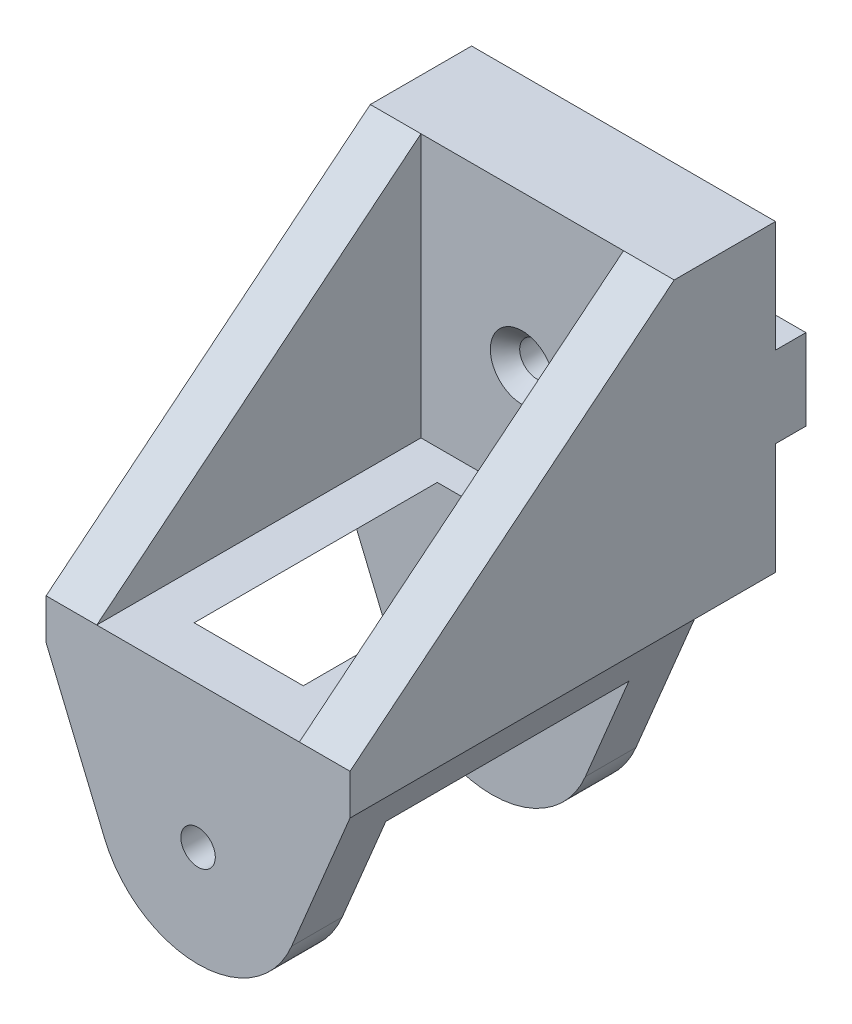
ISO-10303-21;
HEADER;
FILE_DESCRIPTION(('STEP AP214'),'2;1');
FILE_NAME('part.step','',(''),(''),'','','');
FILE_SCHEMA(('AUTOMOTIVE_DESIGN { 1 0 10303 214 1 1 1 1 }'));
ENDSEC;
DATA;
#1=APPLICATION_CONTEXT('core data for automotive mechanical design processes');
#2=APPLICATION_PROTOCOL_DEFINITION('international standard','automotive_design',2000,#1);
#3=PRODUCT_CONTEXT('',#1,'mechanical');
#4=PRODUCT('Part','Part','',(#3));
#5=PRODUCT_RELATED_PRODUCT_CATEGORY('part','',(#4));
#6=PRODUCT_DEFINITION_FORMATION('','',#4);
#7=PRODUCT_DEFINITION_CONTEXT('part definition',#1,'design');
#8=PRODUCT_DEFINITION('design','',#6,#7);
#9=PRODUCT_DEFINITION_SHAPE('','',#8);
#10=(LENGTH_UNIT() NAMED_UNIT(*) SI_UNIT(.MILLI.,.METRE.));
#11=(NAMED_UNIT(*) PLANE_ANGLE_UNIT() SI_UNIT($,.RADIAN.));
#12=(NAMED_UNIT(*) SI_UNIT($,.STERADIAN.) SOLID_ANGLE_UNIT());
#13=UNCERTAINTY_MEASURE_WITH_UNIT(LENGTH_MEASURE(1.E-05),#10,'distance_accuracy_value','');
#14=(GEOMETRIC_REPRESENTATION_CONTEXT(3) GLOBAL_UNCERTAINTY_ASSIGNED_CONTEXT((#13)) GLOBAL_UNIT_ASSIGNED_CONTEXT((#10,
#11,#12)) REPRESENTATION_CONTEXT('',''));
#15=CARTESIAN_POINT('',(0.,0.,0.));
#16=DIRECTION('',(0.,0.,1.));
#17=DIRECTION('',(1.,0.,0.));
#18=AXIS2_PLACEMENT_3D('',#15,#16,#17);
#19=CARTESIAN_POINT('',(15.,-10.,37.));
#20=DIRECTION('',(0.,0.,-1.));
#21=DIRECTION('',(-1.,0.,0.));
#22=AXIS2_PLACEMENT_3D('',#19,#20,#21);
#23=CYLINDRICAL_SURFACE('',#22,15.);
#24=CARTESIAN_POINT('',(15.,-10.,13.));
#25=DIRECTION('',(0.,0.,-1.));
#26=DIRECTION('',(-1.,0.,0.));
#27=AXIS2_PLACEMENT_3D('',#24,#25,#26);
#28=CIRCLE('',#27,15.);
#29=CARTESIAN_POINT('',(1.46910004326963,-3.52584010384713,13.));
#30=VERTEX_POINT('',#29);
#31=CARTESIAN_POINT('',(9.61483519286552,4.,13.));
#32=VERTEX_POINT('',#31);
#33=EDGE_CURVE('E315',#30,#32,#28,.T.);
#34=ORIENTED_EDGE('',*,*,#33,.T.);
#35=DIRECTION('',(0.,0.,-1.));
#36=VECTOR('',#35,1.);
#37=CARTESIAN_POINT('',(9.61483519286552,4.,37.));
#38=LINE('',#37,#36);
#39=CARTESIAN_POINT('',(9.61483519286552,4.,37.));
#40=VERTEX_POINT('',#39);
#41=EDGE_CURVE('E57',#32,#40,#38,.F.);
#42=ORIENTED_EDGE('',*,*,#41,.T.);
#43=CARTESIAN_POINT('',(15.,-10.,37.));
#44=DIRECTION('',(0.,0.,-1.));
#45=DIRECTION('',(-1.,0.,0.));
#46=AXIS2_PLACEMENT_3D('',#43,#44,#45);
#47=CIRCLE('',#46,15.);
#48=CARTESIAN_POINT('',(1.46910004326963,-3.52584010384713,37.));
#49=VERTEX_POINT('',#48);
#50=EDGE_CURVE('E307',#49,#40,#47,.T.);
#51=ORIENTED_EDGE('',*,*,#50,.F.);
#52=DIRECTION('',(0.,0.,-1.));
#53=VECTOR('',#52,1.);
#54=CARTESIAN_POINT('',(1.46910004326964,-3.52584010384713,37.));
#55=LINE('',#54,#53);
#56=EDGE_CURVE('E319',#30,#49,#55,.F.);
#57=ORIENTED_EDGE('',*,*,#56,.F.);
#58=EDGE_LOOP('',(#34,#42,#51,#57));
#59=FACE_BOUND('',#58,.T.);
#60=ADVANCED_FACE('F41',(#59),#23,.F.);
#61=CARTESIAN_POINT('',(15.,-10.,42.));
#62=DIRECTION('',(0.,0.,1.));
#63=DIRECTION('',(1.,0.,0.));
#64=AXIS2_PLACEMENT_3D('',#61,#62,#63);
#65=PLANE('',#64);
#66=DIRECTION('',(1.,0.,0.));
#67=VECTOR('',#66,1.);
#68=CARTESIAN_POINT('',(0.,4.,42.));
#69=LINE('',#68,#67);
#70=CARTESIAN_POINT('',(0.,4.,42.));
#71=VERTEX_POINT('',#70);
#72=CARTESIAN_POINT('',(5.,4.,42.));
#73=VERTEX_POINT('',#72);
#74=EDGE_CURVE('E211',#71,#73,#69,.T.);
#75=ORIENTED_EDGE('',*,*,#74,.F.);
#76=DIRECTION('',(0.,-1.,0.));
#77=VECTOR('',#76,1.);
#78=CARTESIAN_POINT('',(0.,0.,42.));
#79=LINE('',#78,#77);
#80=CARTESIAN_POINT('',(0.,0.,42.));
#81=VERTEX_POINT('',#80);
#82=EDGE_CURVE('E224',#71,#81,#79,.T.);
#83=ORIENTED_EDGE('',*,*,#82,.T.);
#84=DIRECTION('',(0.384615384615384,-0.923076923076923,0.));
#85=VECTOR('',#84,1.);
#86=CARTESIAN_POINT('',(0.,0.,42.));
#87=LINE('',#86,#85);
#88=CARTESIAN_POINT('',(5.76923076923077,-13.8461538461538,42.));
#89=VERTEX_POINT('',#88);
#90=EDGE_CURVE('E236',#81,#89,#87,.T.);
#91=ORIENTED_EDGE('',*,*,#90,.T.);
#92=CARTESIAN_POINT('',(15.,-10.,42.));
#93=DIRECTION('',(0.,0.,1.));
#94=DIRECTION('',(1.,0.,0.));
#95=AXIS2_PLACEMENT_3D('',#92,#93,#94);
#96=CIRCLE('',#95,10.);
#97=CARTESIAN_POINT('',(24.2307692307692,-13.8461538461539,42.));
#98=VERTEX_POINT('',#97);
#99=EDGE_CURVE('E239',#89,#98,#96,.T.);
#100=ORIENTED_EDGE('',*,*,#99,.T.);
#101=DIRECTION('',(0.384615384615384,0.923076923076923,0.));
#102=VECTOR('',#101,1.);
#103=CARTESIAN_POINT('',(30.,0.,42.));
#104=LINE('',#103,#102);
#105=CARTESIAN_POINT('',(30.,0.,42.));
#106=VERTEX_POINT('',#105);
#107=EDGE_CURVE('E247',#98,#106,#104,.T.);
#108=ORIENTED_EDGE('',*,*,#107,.T.);
#109=DIRECTION('',(0.,1.,0.));
#110=VECTOR('',#109,1.);
#111=CARTESIAN_POINT('',(30.,0.,42.));
#112=LINE('',#111,#110);
#113=CARTESIAN_POINT('',(30.,4.,42.));
#114=VERTEX_POINT('',#113);
#115=EDGE_CURVE('E237',#106,#114,#112,.T.);
#116=ORIENTED_EDGE('',*,*,#115,.T.);
#117=CARTESIAN_POINT('',(25.,4.,42.));
#118=VERTEX_POINT('',#117);
#119=EDGE_CURVE('E217',#118,#114,#69,.T.);
#120=ORIENTED_EDGE('',*,*,#119,.F.);
#121=DIRECTION('',(1.,0.,0.));
#122=VECTOR('',#121,1.);
#123=CARTESIAN_POINT('',(5.,4.,42.));
#124=LINE('',#123,#122);
#125=EDGE_CURVE('E228',#73,#118,#124,.T.);
#126=ORIENTED_EDGE('',*,*,#125,.F.);
#127=EDGE_LOOP('',(#75,#83,#91,#100,#108,#116,#120,#126));
#128=FACE_BOUND('',#127,.T.);
#129=CARTESIAN_POINT('',(15.,-10.,42.));
#130=DIRECTION('',(0.,0.,-1.));
#131=DIRECTION('',(-1.,0.,0.));
#132=AXIS2_PLACEMENT_3D('',#129,#130,#131);
#133=CIRCLE('',#132,1.7);
#134=CARTESIAN_POINT('',(13.3,-10.,42.));
#135=VERTEX_POINT('',#134);
#136=EDGE_CURVE('E374',#135,#135,#133,.T.);
#137=ORIENTED_EDGE('',*,*,#136,.T.);
#138=EDGE_LOOP('',(#137));
#139=FACE_BOUND('',#138,.T.);
#140=ADVANCED_FACE('F222',(#128,#139),#65,.T.);
#141=CARTESIAN_POINT('',(15.,-10.,0.));
#142=DIRECTION('',(0.,0.,1.));
#143=DIRECTION('',(1.,0.,0.));
#144=AXIS2_PLACEMENT_3D('',#141,#142,#143);
#145=PLANE('',#144);
#146=CARTESIAN_POINT('',(15.,15.,0.));
#147=DIRECTION('',(0.,0.,1.));
#148=DIRECTION('',(1.,0.,0.));
#149=AXIS2_PLACEMENT_3D('',#146,#147,#148);
#150=CIRCLE('',#149,1.7);
#151=CARTESIAN_POINT('',(16.7,15.,0.));
#152=VERTEX_POINT('',#151);
#153=EDGE_CURVE('E45',#152,#152,#150,.T.);
#154=ORIENTED_EDGE('',*,*,#153,.T.);
#155=EDGE_LOOP('',(#154));
#156=FACE_BOUND('',#155,.T.);
#157=DIRECTION('',(1.,0.,0.));
#158=VECTOR('',#157,1.);
#159=CARTESIAN_POINT('',(0.,19.,0.));
#160=LINE('',#159,#158);
#161=CARTESIAN_POINT('',(0.,19.,0.));
#162=VERTEX_POINT('',#161);
#163=CARTESIAN_POINT('',(5.,19.,0.));
#164=VERTEX_POINT('',#163);
#165=EDGE_CURVE('E386',#162,#164,#160,.T.);
#166=ORIENTED_EDGE('',*,*,#165,.F.);
#167=DIRECTION('',(0.,-1.,0.));
#168=VECTOR('',#167,1.);
#169=CARTESIAN_POINT('',(0.,0.,0.));
#170=LINE('',#169,#168);
#171=CARTESIAN_POINT('',(0.,30.,0.));
#172=VERTEX_POINT('',#171);
#173=EDGE_CURVE('E242',#172,#162,#170,.T.);
#174=ORIENTED_EDGE('',*,*,#173,.F.);
#175=DIRECTION('',(-1.,0.,0.));
#176=VECTOR('',#175,1.);
#177=CARTESIAN_POINT('',(0.,30.,0.));
#178=LINE('',#177,#176);
#179=CARTESIAN_POINT('',(30.,30.,0.));
#180=VERTEX_POINT('',#179);
#181=EDGE_CURVE('E253',#180,#172,#178,.T.);
#182=ORIENTED_EDGE('',*,*,#181,.F.);
#183=DIRECTION('',(0.,1.,0.));
#184=VECTOR('',#183,1.);
#185=CARTESIAN_POINT('',(30.,0.,0.));
#186=LINE('',#185,#184);
#187=CARTESIAN_POINT('',(30.,19.,0.));
#188=VERTEX_POINT('',#187);
#189=EDGE_CURVE('E254',#188,#180,#186,.T.);
#190=ORIENTED_EDGE('',*,*,#189,.F.);
#191=DIRECTION('',(1.,0.,0.));
#192=VECTOR('',#191,1.);
#193=CARTESIAN_POINT('',(30.,19.,0.));
#194=LINE('',#193,#192);
#195=CARTESIAN_POINT('',(25.,19.,0.));
#196=VERTEX_POINT('',#195);
#197=EDGE_CURVE('E415',#196,#188,#194,.T.);
#198=ORIENTED_EDGE('',*,*,#197,.F.);
#199=DIRECTION('',(0.,1.,0.));
#200=VECTOR('',#199,1.);
#201=CARTESIAN_POINT('',(25.,19.,0.));
#202=LINE('',#201,#200);
#203=CARTESIAN_POINT('',(25.,11.,0.));
#204=VERTEX_POINT('',#203);
#205=EDGE_CURVE('E423',#204,#196,#202,.T.);
#206=ORIENTED_EDGE('',*,*,#205,.F.);
#207=DIRECTION('',(-1.,0.,0.));
#208=VECTOR('',#207,1.);
#209=CARTESIAN_POINT('',(30.,11.,0.));
#210=LINE('',#209,#208);
#211=CARTESIAN_POINT('',(30.,11.,0.));
#212=VERTEX_POINT('',#211);
#213=EDGE_CURVE('E410',#212,#204,#210,.T.);
#214=ORIENTED_EDGE('',*,*,#213,.F.);
#215=CARTESIAN_POINT('',(30.,0.,0.));
#216=VERTEX_POINT('',#215);
#217=EDGE_CURVE('E250',#216,#212,#186,.T.);
#218=ORIENTED_EDGE('',*,*,#217,.F.);
#219=DIRECTION('',(1.,0.,0.));
#220=VECTOR('',#219,1.);
#221=CARTESIAN_POINT('',(30.,0.,0.));
#222=LINE('',#221,#220);
#223=CARTESIAN_POINT('',(0.,0.,0.));
#224=VERTEX_POINT('',#223);
#225=EDGE_CURVE('E437',#224,#216,#222,.T.);
#226=ORIENTED_EDGE('',*,*,#225,.F.);
#227=CARTESIAN_POINT('',(0.,11.,0.));
#228=VERTEX_POINT('',#227);
#229=EDGE_CURVE('E257',#228,#224,#170,.T.);
#230=ORIENTED_EDGE('',*,*,#229,.F.);
#231=DIRECTION('',(-1.,0.,0.));
#232=VECTOR('',#231,1.);
#233=CARTESIAN_POINT('',(0.,11.,0.));
#234=LINE('',#233,#232);
#235=CARTESIAN_POINT('',(5.,11.,0.));
#236=VERTEX_POINT('',#235);
#237=EDGE_CURVE('E391',#236,#228,#234,.T.);
#238=ORIENTED_EDGE('',*,*,#237,.F.);
#239=DIRECTION('',(0.,-1.,0.));
#240=VECTOR('',#239,1.);
#241=CARTESIAN_POINT('',(5.,19.,0.));
#242=LINE('',#241,#240);
#243=EDGE_CURVE('E398',#164,#236,#242,.T.);
#244=ORIENTED_EDGE('',*,*,#243,.F.);
#245=EDGE_LOOP('',(#166,#174,#182,#190,#198,#206,#214,#218,#226,#230,#238,#244));
#246=FACE_BOUND('',#245,.T.);
#247=ADVANCED_FACE('F335',(#156,#246),#145,.F.);
#248=CARTESIAN_POINT('',(0.,0.,42.));
#249=DIRECTION('',(0.923076923076923,0.384615384615384,0.));
#250=DIRECTION('',(-0.384615384615384,0.923076923076923,0.));
#251=AXIS2_PLACEMENT_3D('',#248,#249,#250);
#252=PLANE('',#251);
#253=DIRECTION('',(-0.384615384615384,0.923076923076923,0.));
#254=VECTOR('',#253,1.);
#255=CARTESIAN_POINT('',(0.,0.,8.));
#256=LINE('',#255,#254);
#257=CARTESIAN_POINT('',(5.76923076923077,-13.8461538461538,8.));
#258=VERTEX_POINT('',#257);
#259=CARTESIAN_POINT('',(0.,0.,8.));
#260=VERTEX_POINT('',#259);
#261=EDGE_CURVE('E287',#258,#260,#256,.T.);
#262=ORIENTED_EDGE('',*,*,#261,.F.);
#263=DIRECTION('',(0.,0.,-1.));
#264=VECTOR('',#263,1.);
#265=CARTESIAN_POINT('',(5.76923076923077,-13.8461538461538,42.));
#266=LINE('',#265,#264);
#267=CARTESIAN_POINT('',(5.76923076923077,-13.8461538461538,13.));
#268=VERTEX_POINT('',#267);
#269=EDGE_CURVE('E266',#268,#258,#266,.T.);
#270=ORIENTED_EDGE('',*,*,#269,.F.);
#271=DIRECTION('',(-0.384615384615384,0.923076923076923,0.));
#272=VECTOR('',#271,1.);
#273=CARTESIAN_POINT('',(0.,0.,13.));
#274=LINE('',#273,#272);
#275=EDGE_CURVE('E306',#268,#30,#274,.T.);
#276=ORIENTED_EDGE('',*,*,#275,.T.);
#277=ORIENTED_EDGE('',*,*,#56,.T.);
#278=DIRECTION('',(-0.384615384615384,0.923076923076923,0.));
#279=VECTOR('',#278,1.);
#280=CARTESIAN_POINT('',(0.,0.,37.));
#281=LINE('',#280,#279);
#282=CARTESIAN_POINT('',(5.76923076923077,-13.8461538461538,37.));
#283=VERTEX_POINT('',#282);
#284=EDGE_CURVE('E318',#283,#49,#281,.T.);
#285=ORIENTED_EDGE('',*,*,#284,.F.);
#286=EDGE_CURVE('E267',#89,#283,#266,.T.);
#287=ORIENTED_EDGE('',*,*,#286,.F.);
#288=ORIENTED_EDGE('',*,*,#90,.F.);
#289=DIRECTION('',(0.,0.,-1.));
#290=VECTOR('',#289,1.);
#291=CARTESIAN_POINT('',(0.,0.,42.));
#292=LINE('',#291,#290);
#293=EDGE_CURVE('E234',#81,#260,#292,.T.);
#294=ORIENTED_EDGE('',*,*,#293,.T.);
#295=EDGE_LOOP('',(#262,#270,#276,#277,#285,#287,#288,#294));
#296=FACE_BOUND('',#295,.T.);
#297=ADVANCED_FACE('F297',(#296),#252,.F.);
#298=CARTESIAN_POINT('',(30.,0.,42.));
#299=DIRECTION('',(-0.923076923076923,0.384615384615384,0.));
#300=DIRECTION('',(-0.384615384615384,-0.923076923076923,0.));
#301=AXIS2_PLACEMENT_3D('',#298,#299,#300);
#302=PLANE('',#301);
#303=DIRECTION('',(-0.384615384615384,-0.923076923076923,0.));
#304=VECTOR('',#303,1.);
#305=CARTESIAN_POINT('',(30.,0.,8.));
#306=LINE('',#305,#304);
#307=CARTESIAN_POINT('',(30.,0.,8.));
#308=VERTEX_POINT('',#307);
#309=CARTESIAN_POINT('',(24.2307692307692,-13.8461538461539,8.));
#310=VERTEX_POINT('',#309);
#311=EDGE_CURVE('E290',#308,#310,#306,.T.);
#312=ORIENTED_EDGE('',*,*,#311,.F.);
#313=DIRECTION('',(0.,0.,-1.));
#314=VECTOR('',#313,1.);
#315=CARTESIAN_POINT('',(30.,0.,42.));
#316=LINE('',#315,#314);
#317=EDGE_CURVE('E249',#106,#308,#316,.T.);
#318=ORIENTED_EDGE('',*,*,#317,.F.);
#319=ORIENTED_EDGE('',*,*,#107,.F.);
#320=DIRECTION('',(0.,0.,-1.));
#321=VECTOR('',#320,1.);
#322=CARTESIAN_POINT('',(24.2307692307692,-13.8461538461539,42.));
#323=LINE('',#322,#321);
#324=CARTESIAN_POINT('',(24.2307692307692,-13.8461538461539,37.));
#325=VERTEX_POINT('',#324);
#326=EDGE_CURVE('E263',#98,#325,#323,.T.);
#327=ORIENTED_EDGE('',*,*,#326,.T.);
#328=DIRECTION('',(-0.384615384615384,-0.923076923076923,0.));
#329=VECTOR('',#328,1.);
#330=CARTESIAN_POINT('',(30.,0.,37.));
#331=LINE('',#330,#329);
#332=CARTESIAN_POINT('',(28.5308999567304,-3.52584010384713,37.));
#333=VERTEX_POINT('',#332);
#334=EDGE_CURVE('E281',#333,#325,#331,.T.);
#335=ORIENTED_EDGE('',*,*,#334,.F.);
#336=DIRECTION('',(0.,0.,-1.));
#337=VECTOR('',#336,1.);
#338=CARTESIAN_POINT('',(28.5308999567304,-3.52584010384713,37.));
#339=LINE('',#338,#337);
#340=CARTESIAN_POINT('',(28.5308999567304,-3.52584010384713,13.));
#341=VERTEX_POINT('',#340);
#342=EDGE_CURVE('E278',#333,#341,#339,.T.);
#343=ORIENTED_EDGE('',*,*,#342,.T.);
#344=DIRECTION('',(-0.384615384615384,-0.923076923076923,0.));
#345=VECTOR('',#344,1.);
#346=CARTESIAN_POINT('',(30.,0.,13.));
#347=LINE('',#346,#345);
#348=CARTESIAN_POINT('',(24.2307692307692,-13.8461538461539,13.));
#349=VERTEX_POINT('',#348);
#350=EDGE_CURVE('E275',#341,#349,#347,.T.);
#351=ORIENTED_EDGE('',*,*,#350,.T.);
#352=EDGE_CURVE('E262',#349,#310,#323,.T.);
#353=ORIENTED_EDGE('',*,*,#352,.T.);
#354=EDGE_LOOP('',(#312,#318,#319,#327,#335,#343,#351,#353));
#355=FACE_BOUND('',#354,.T.);
#356=ADVANCED_FACE('F503',(#355),#302,.F.);
#357=CARTESIAN_POINT('',(15.,-10.,42.));
#358=DIRECTION('',(0.,0.,-1.));
#359=DIRECTION('',(-1.,0.,0.));
#360=AXIS2_PLACEMENT_3D('',#357,#358,#359);
#361=CYLINDRICAL_SURFACE('',#360,10.);
#362=CARTESIAN_POINT('',(15.,-10.,8.));
#363=DIRECTION('',(0.,0.,-1.));
#364=DIRECTION('',(-1.,0.,0.));
#365=AXIS2_PLACEMENT_3D('',#362,#363,#364);
#366=CIRCLE('',#365,10.);
#367=EDGE_CURVE('E50',#310,#258,#366,.T.);
#368=ORIENTED_EDGE('',*,*,#367,.F.);
#369=ORIENTED_EDGE('',*,*,#352,.F.);
#370=CARTESIAN_POINT('',(15.,-10.,13.));
#371=DIRECTION('',(0.,0.,-1.));
#372=DIRECTION('',(-1.,0.,0.));
#373=AXIS2_PLACEMENT_3D('',#370,#371,#372);
#374=CIRCLE('',#373,10.);
#375=EDGE_CURVE('E303',#349,#268,#374,.T.);
#376=ORIENTED_EDGE('',*,*,#375,.T.);
#377=ORIENTED_EDGE('',*,*,#269,.T.);
#378=EDGE_LOOP('',(#368,#369,#376,#377));
#379=FACE_BOUND('',#378,.T.);
#380=ADVANCED_FACE('F302',(#379),#361,.T.);
#381=CARTESIAN_POINT('',(15.,-10.,37.));
#382=DIRECTION('',(0.,0.,-1.));
#383=DIRECTION('',(-1.,0.,0.));
#384=AXIS2_PLACEMENT_3D('',#381,#382,#383);
#385=CIRCLE('',#384,10.);
#386=EDGE_CURVE('E309',#325,#283,#385,.T.);
#387=ORIENTED_EDGE('',*,*,#386,.F.);
#388=ORIENTED_EDGE('',*,*,#326,.F.);
#389=ORIENTED_EDGE('',*,*,#99,.F.);
#390=ORIENTED_EDGE('',*,*,#286,.T.);
#391=EDGE_LOOP('',(#387,#388,#389,#390));
#392=FACE_BOUND('',#391,.T.);
#393=ADVANCED_FACE('F509',(#392),#361,.T.);
#394=CARTESIAN_POINT('',(30.,0.,42.));
#395=DIRECTION('',(-1.,0.,0.));
#396=DIRECTION('',(0.,0.,1.));
#397=AXIS2_PLACEMENT_3D('',#394,#395,#396);
#398=PLANE('',#397);
#399=DIRECTION('',(0.,0.,-1.));
#400=VECTOR('',#399,1.);
#401=CARTESIAN_POINT('',(30.,30.,42.));
#402=LINE('',#401,#400);
#403=CARTESIAN_POINT('',(30.,30.,10.));
#404=VERTEX_POINT('',#403);
#405=EDGE_CURVE('E273',#404,#180,#402,.T.);
#406=ORIENTED_EDGE('',*,*,#405,.F.);
#407=DIRECTION('',(0.,0.630592625094466,-0.776114000116266));
#408=VECTOR('',#407,1.);
#409=CARTESIAN_POINT('',(30.,30.,10.));
#410=LINE('',#409,#408);
#411=EDGE_CURVE('E218',#114,#404,#410,.T.);
#412=ORIENTED_EDGE('',*,*,#411,.F.);
#413=ORIENTED_EDGE('',*,*,#115,.F.);
#414=ORIENTED_EDGE('',*,*,#317,.T.);
#415=DIRECTION('',(0.,0.,-1.));
#416=VECTOR('',#415,1.);
#417=CARTESIAN_POINT('',(30.,0.,49.0555127546399));
#418=LINE('',#417,#416);
#419=EDGE_CURVE('E440',#308,#216,#418,.T.);
#420=ORIENTED_EDGE('',*,*,#419,.T.);
#421=ORIENTED_EDGE('',*,*,#217,.T.);
#422=DIRECTION('',(0.,0.,1.));
#423=VECTOR('',#422,1.);
#424=CARTESIAN_POINT('',(30.,11.,-3.));
#425=LINE('',#424,#423);
#426=CARTESIAN_POINT('',(30.,11.,-3.));
#427=VERTEX_POINT('',#426);
#428=EDGE_CURVE('E434',#427,#212,#425,.T.);
#429=ORIENTED_EDGE('',*,*,#428,.F.);
#430=DIRECTION('',(0.,-1.,0.));
#431=VECTOR('',#430,1.);
#432=CARTESIAN_POINT('',(30.,19.,-3.));
#433=LINE('',#432,#431);
#434=CARTESIAN_POINT('',(30.,19.,-3.));
#435=VERTEX_POINT('',#434);
#436=EDGE_CURVE('E411',#435,#427,#433,.T.);
#437=ORIENTED_EDGE('',*,*,#436,.F.);
#438=DIRECTION('',(0.,0.,1.));
#439=VECTOR('',#438,1.);
#440=CARTESIAN_POINT('',(30.,19.,-3.));
#441=LINE('',#440,#439);
#442=EDGE_CURVE('E330',#435,#188,#441,.T.);
#443=ORIENTED_EDGE('',*,*,#442,.T.);
#444=ORIENTED_EDGE('',*,*,#189,.T.);
#445=EDGE_LOOP('',(#406,#412,#413,#414,#420,#421,#429,#437,#443,#444));
#446=FACE_BOUND('',#445,.T.);
#447=ADVANCED_FACE('F43',(#446),#398,.F.);
#448=CARTESIAN_POINT('',(0.,30.,42.));
#449=DIRECTION('',(0.,-1.,0.));
#450=DIRECTION('',(0.,0.,-1.));
#451=AXIS2_PLACEMENT_3D('',#448,#449,#450);
#452=PLANE('',#451);
#453=DIRECTION('',(0.,0.,-1.));
#454=VECTOR('',#453,1.);
#455=CARTESIAN_POINT('',(0.,30.,42.));
#456=LINE('',#455,#454);
#457=CARTESIAN_POINT('',(0.,30.,10.));
#458=VERTEX_POINT('',#457);
#459=EDGE_CURVE('E271',#458,#172,#456,.T.);
#460=ORIENTED_EDGE('',*,*,#459,.F.);
#461=DIRECTION('',(1.,0.,0.));
#462=VECTOR('',#461,1.);
#463=CARTESIAN_POINT('',(0.,30.,10.));
#464=LINE('',#463,#462);
#465=CARTESIAN_POINT('',(5.,30.,10.));
#466=VERTEX_POINT('',#465);
#467=EDGE_CURVE('E214',#458,#466,#464,.T.);
#468=ORIENTED_EDGE('',*,*,#467,.T.);
#469=DIRECTION('',(-1.,0.,0.));
#470=VECTOR('',#469,1.);
#471=CARTESIAN_POINT('',(5.,30.,10.));
#472=LINE('',#471,#470);
#473=CARTESIAN_POINT('',(25.,30.,10.));
#474=VERTEX_POINT('',#473);
#475=EDGE_CURVE('E341',#474,#466,#472,.T.);
#476=ORIENTED_EDGE('',*,*,#475,.F.);
#477=EDGE_CURVE('E229',#474,#404,#464,.T.);
#478=ORIENTED_EDGE('',*,*,#477,.T.);
#479=ORIENTED_EDGE('',*,*,#405,.T.);
#480=ORIENTED_EDGE('',*,*,#181,.T.);
#481=EDGE_LOOP('',(#460,#468,#476,#478,#479,#480));
#482=FACE_BOUND('',#481,.T.);
#483=ADVANCED_FACE('F337',(#482),#452,.F.);
#484=CARTESIAN_POINT('',(0.,0.,42.));
#485=DIRECTION('',(1.,0.,0.));
#486=DIRECTION('',(0.,0.,-1.));
#487=AXIS2_PLACEMENT_3D('',#484,#485,#486);
#488=PLANE('',#487);
#489=ORIENTED_EDGE('',*,*,#82,.F.);
#490=DIRECTION('',(0.,0.630592625094466,-0.776114000116266));
#491=VECTOR('',#490,1.);
#492=CARTESIAN_POINT('',(0.,30.,10.));
#493=LINE('',#492,#491);
#494=EDGE_CURVE('E208',#71,#458,#493,.T.);
#495=ORIENTED_EDGE('',*,*,#494,.T.);
#496=ORIENTED_EDGE('',*,*,#459,.T.);
#497=ORIENTED_EDGE('',*,*,#173,.T.);
#498=DIRECTION('',(0.,0.,1.));
#499=VECTOR('',#498,1.);
#500=CARTESIAN_POINT('',(0.,19.,-3.));
#501=LINE('',#500,#499);
#502=CARTESIAN_POINT('',(0.,19.,-3.));
#503=VERTEX_POINT('',#502);
#504=EDGE_CURVE('E408',#503,#162,#501,.T.);
#505=ORIENTED_EDGE('',*,*,#504,.F.);
#506=DIRECTION('',(0.,1.,0.));
#507=VECTOR('',#506,1.);
#508=CARTESIAN_POINT('',(0.,19.,-3.));
#509=LINE('',#508,#507);
#510=CARTESIAN_POINT('',(0.,11.,-3.));
#511=VERTEX_POINT('',#510);
#512=EDGE_CURVE('E387',#511,#503,#509,.T.);
#513=ORIENTED_EDGE('',*,*,#512,.F.);
#514=DIRECTION('',(0.,0.,1.));
#515=VECTOR('',#514,1.);
#516=CARTESIAN_POINT('',(0.,11.,-3.));
#517=LINE('',#516,#515);
#518=EDGE_CURVE('E64',#511,#228,#517,.T.);
#519=ORIENTED_EDGE('',*,*,#518,.T.);
#520=ORIENTED_EDGE('',*,*,#229,.T.);
#521=DIRECTION('',(0.,0.,-1.));
#522=VECTOR('',#521,1.);
#523=CARTESIAN_POINT('',(0.,0.,49.0555127546399));
#524=LINE('',#523,#522);
#525=EDGE_CURVE('E442',#260,#224,#524,.T.);
#526=ORIENTED_EDGE('',*,*,#525,.F.);
#527=ORIENTED_EDGE('',*,*,#293,.F.);
#528=EDGE_LOOP('',(#489,#495,#496,#497,#505,#513,#519,#520,#526,#527));
#529=FACE_BOUND('',#528,.T.);
#530=ADVANCED_FACE('F231',(#529),#488,.F.);
#531=CARTESIAN_POINT('',(20.3851648071345,4.,37.));
#532=VERTEX_POINT('',#531);
#533=EDGE_CURVE('E312',#532,#333,#47,.T.);
#534=ORIENTED_EDGE('',*,*,#533,.F.);
#535=DIRECTION('',(0.,0.,-1.));
#536=VECTOR('',#535,1.);
#537=CARTESIAN_POINT('',(20.3851648071345,4.,37.));
#538=LINE('',#537,#536);
#539=CARTESIAN_POINT('',(20.3851648071345,4.,13.));
#540=VERTEX_POINT('',#539);
#541=EDGE_CURVE('E366',#532,#540,#538,.T.);
#542=ORIENTED_EDGE('',*,*,#541,.T.);
#543=EDGE_CURVE('E299',#540,#341,#28,.T.);
#544=ORIENTED_EDGE('',*,*,#543,.T.);
#545=ORIENTED_EDGE('',*,*,#342,.F.);
#546=EDGE_LOOP('',(#534,#542,#544,#545));
#547=FACE_BOUND('',#546,.T.);
#548=ADVANCED_FACE('F478',(#547),#23,.F.);
#549=CARTESIAN_POINT('',(15.,-10.,37.));
#550=DIRECTION('',(0.,0.,-1.));
#551=DIRECTION('',(-1.,0.,0.));
#552=AXIS2_PLACEMENT_3D('',#549,#550,#551);
#553=PLANE('',#552);
#554=DIRECTION('',(-1.,0.,0.));
#555=VECTOR('',#554,1.);
#556=CARTESIAN_POINT('',(15.,4.,37.));
#557=LINE('',#556,#555);
#558=EDGE_CURVE('E372',#532,#40,#557,.T.);
#559=ORIENTED_EDGE('',*,*,#558,.F.);
#560=ORIENTED_EDGE('',*,*,#533,.T.);
#561=ORIENTED_EDGE('',*,*,#334,.T.);
#562=ORIENTED_EDGE('',*,*,#386,.T.);
#563=ORIENTED_EDGE('',*,*,#284,.T.);
#564=ORIENTED_EDGE('',*,*,#50,.T.);
#565=EDGE_LOOP('',(#559,#560,#561,#562,#563,#564));
#566=FACE_BOUND('',#565,.T.);
#567=CARTESIAN_POINT('',(15.,-10.,37.));
#568=DIRECTION('',(0.,0.,-1.));
#569=DIRECTION('',(-1.,0.,0.));
#570=AXIS2_PLACEMENT_3D('',#567,#568,#569);
#571=CIRCLE('',#570,1.7);
#572=CARTESIAN_POINT('',(13.3,-10.,37.));
#573=VERTEX_POINT('',#572);
#574=EDGE_CURVE('E383',#573,#573,#571,.T.);
#575=ORIENTED_EDGE('',*,*,#574,.F.);
#576=EDGE_LOOP('',(#575));
#577=FACE_BOUND('',#576,.T.);
#578=ADVANCED_FACE('F486',(#566,#577),#553,.T.);
#579=CARTESIAN_POINT('',(15.,-10.,13.));
#580=DIRECTION('',(0.,0.,-1.));
#581=DIRECTION('',(-1.,0.,0.));
#582=AXIS2_PLACEMENT_3D('',#579,#580,#581);
#583=PLANE('',#582);
#584=CARTESIAN_POINT('',(15.,-10.,13.));
#585=DIRECTION('',(0.,0.,-1.));
#586=DIRECTION('',(-1.,0.,0.));
#587=AXIS2_PLACEMENT_3D('',#584,#585,#586);
#588=CIRCLE('',#587,1.7);
#589=CARTESIAN_POINT('',(13.3,-10.,13.));
#590=VERTEX_POINT('',#589);
#591=EDGE_CURVE('E380',#590,#590,#588,.T.);
#592=ORIENTED_EDGE('',*,*,#591,.T.);
#593=EDGE_LOOP('',(#592));
#594=FACE_BOUND('',#593,.T.);
#595=ORIENTED_EDGE('',*,*,#543,.F.);
#596=DIRECTION('',(-1.,0.,0.));
#597=VECTOR('',#596,1.);
#598=CARTESIAN_POINT('',(15.,4.,13.));
#599=LINE('',#598,#597);
#600=EDGE_CURVE('E12',#540,#32,#599,.T.);
#601=ORIENTED_EDGE('',*,*,#600,.T.);
#602=ORIENTED_EDGE('',*,*,#33,.F.);
#603=ORIENTED_EDGE('',*,*,#275,.F.);
#604=ORIENTED_EDGE('',*,*,#375,.F.);
#605=ORIENTED_EDGE('',*,*,#350,.F.);
#606=EDGE_LOOP('',(#595,#601,#602,#603,#604,#605));
#607=FACE_BOUND('',#606,.T.);
#608=ADVANCED_FACE('F492',(#594,#607),#583,.F.);
#609=CARTESIAN_POINT('',(15.,-10.,8.));
#610=DIRECTION('',(0.,0.,-1.));
#611=DIRECTION('',(-1.,0.,0.));
#612=AXIS2_PLACEMENT_3D('',#609,#610,#611);
#613=PLANE('',#612);
#614=CARTESIAN_POINT('',(15.,-10.,8.));
#615=DIRECTION('',(0.,0.,-1.));
#616=DIRECTION('',(-1.,0.,0.));
#617=AXIS2_PLACEMENT_3D('',#614,#615,#616);
#618=CIRCLE('',#617,1.7);
#619=CARTESIAN_POINT('',(13.3,-10.,8.));
#620=VERTEX_POINT('',#619);
#621=EDGE_CURVE('E377',#620,#620,#618,.T.);
#622=ORIENTED_EDGE('',*,*,#621,.F.);
#623=EDGE_LOOP('',(#622));
#624=FACE_BOUND('',#623,.T.);
#625=ORIENTED_EDGE('',*,*,#261,.T.);
#626=DIRECTION('',(-1.,0.,0.));
#627=VECTOR('',#626,1.);
#628=CARTESIAN_POINT('',(30.,0.,8.));
#629=LINE('',#628,#627);
#630=EDGE_CURVE('E438',#308,#260,#629,.T.);
#631=ORIENTED_EDGE('',*,*,#630,.F.);
#632=ORIENTED_EDGE('',*,*,#311,.T.);
#633=ORIENTED_EDGE('',*,*,#367,.T.);
#634=EDGE_LOOP('',(#625,#631,#632,#633));
#635=FACE_BOUND('',#634,.T.);
#636=ADVANCED_FACE('F286',(#624,#635),#613,.T.);
#637=CARTESIAN_POINT('',(30.,0.,49.0555127546399));
#638=DIRECTION('',(0.,1.,0.));
#639=DIRECTION('',(0.,0.,1.));
#640=AXIS2_PLACEMENT_3D('',#637,#638,#639);
#641=PLANE('',#640);
#642=ORIENTED_EDGE('',*,*,#630,.T.);
#643=ORIENTED_EDGE('',*,*,#525,.T.);
#644=ORIENTED_EDGE('',*,*,#225,.T.);
#645=ORIENTED_EDGE('',*,*,#419,.F.);
#646=EDGE_LOOP('',(#642,#643,#644,#645));
#647=FACE_BOUND('',#646,.T.);
#648=ADVANCED_FACE('F449',(#647),#641,.F.);
#649=CARTESIAN_POINT('',(30.,11.,-3.));
#650=DIRECTION('',(0.,1.,0.));
#651=DIRECTION('',(0.,0.,1.));
#652=AXIS2_PLACEMENT_3D('',#649,#650,#651);
#653=PLANE('',#652);
#654=ORIENTED_EDGE('',*,*,#213,.T.);
#655=DIRECTION('',(0.,0.,1.));
#656=VECTOR('',#655,1.);
#657=CARTESIAN_POINT('',(25.,11.,-3.));
#658=LINE('',#657,#656);
#659=CARTESIAN_POINT('',(25.,11.,-3.));
#660=VERTEX_POINT('',#659);
#661=EDGE_CURVE('E431',#660,#204,#658,.T.);
#662=ORIENTED_EDGE('',*,*,#661,.F.);
#663=DIRECTION('',(-1.,0.,0.));
#664=VECTOR('',#663,1.);
#665=CARTESIAN_POINT('',(30.,11.,-3.));
#666=LINE('',#665,#664);
#667=EDGE_CURVE('E414',#427,#660,#666,.T.);
#668=ORIENTED_EDGE('',*,*,#667,.F.);
#669=ORIENTED_EDGE('',*,*,#428,.T.);
#670=EDGE_LOOP('',(#654,#662,#668,#669));
#671=FACE_BOUND('',#670,.T.);
#672=ADVANCED_FACE('F456',(#671),#653,.F.);
#673=CARTESIAN_POINT('',(25.,19.,-3.));
#674=DIRECTION('',(1.,0.,0.));
#675=DIRECTION('',(0.,1.,0.));
#676=AXIS2_PLACEMENT_3D('',#673,#674,#675);
#677=PLANE('',#676);
#678=ORIENTED_EDGE('',*,*,#205,.T.);
#679=DIRECTION('',(0.,0.,1.));
#680=VECTOR('',#679,1.);
#681=CARTESIAN_POINT('',(25.,19.,-3.));
#682=LINE('',#681,#680);
#683=CARTESIAN_POINT('',(25.,19.,-3.));
#684=VERTEX_POINT('',#683);
#685=EDGE_CURVE('E428',#684,#196,#682,.T.);
#686=ORIENTED_EDGE('',*,*,#685,.F.);
#687=DIRECTION('',(0.,1.,0.));
#688=VECTOR('',#687,1.);
#689=CARTESIAN_POINT('',(25.,19.,-3.));
#690=LINE('',#689,#688);
#691=EDGE_CURVE('E417',#660,#684,#690,.T.);
#692=ORIENTED_EDGE('',*,*,#691,.F.);
#693=ORIENTED_EDGE('',*,*,#661,.T.);
#694=EDGE_LOOP('',(#678,#686,#692,#693));
#695=FACE_BOUND('',#694,.T.);
#696=ADVANCED_FACE('F466',(#695),#677,.F.);
#697=CARTESIAN_POINT('',(30.,19.,-3.));
#698=DIRECTION('',(0.,-1.,0.));
#699=DIRECTION('',(1.,0.,0.));
#700=AXIS2_PLACEMENT_3D('',#697,#698,#699);
#701=PLANE('',#700);
#702=ORIENTED_EDGE('',*,*,#197,.T.);
#703=ORIENTED_EDGE('',*,*,#442,.F.);
#704=DIRECTION('',(1.,0.,0.));
#705=VECTOR('',#704,1.);
#706=CARTESIAN_POINT('',(30.,19.,-3.));
#707=LINE('',#706,#705);
#708=EDGE_CURVE('E419',#684,#435,#707,.T.);
#709=ORIENTED_EDGE('',*,*,#708,.F.);
#710=ORIENTED_EDGE('',*,*,#685,.T.);
#711=EDGE_LOOP('',(#702,#703,#709,#710));
#712=FACE_BOUND('',#711,.T.);
#713=ADVANCED_FACE('F464',(#712),#701,.F.);
#714=CARTESIAN_POINT('',(0.,0.,-3.));
#715=DIRECTION('',(0.,0.,-1.));
#716=DIRECTION('',(-1.,0.,0.));
#717=AXIS2_PLACEMENT_3D('',#714,#715,#716);
#718=PLANE('',#717);
#719=ORIENTED_EDGE('',*,*,#436,.T.);
#720=ORIENTED_EDGE('',*,*,#667,.T.);
#721=ORIENTED_EDGE('',*,*,#691,.T.);
#722=ORIENTED_EDGE('',*,*,#708,.T.);
#723=EDGE_LOOP('',(#719,#720,#721,#722));
#724=FACE_BOUND('',#723,.T.);
#725=ADVANCED_FACE('F460',(#724),#718,.T.);
#726=CARTESIAN_POINT('',(0.,19.,-3.));
#727=DIRECTION('',(0.,-1.,0.));
#728=DIRECTION('',(0.,0.,-1.));
#729=AXIS2_PLACEMENT_3D('',#726,#727,#728);
#730=PLANE('',#729);
#731=ORIENTED_EDGE('',*,*,#165,.T.);
#732=DIRECTION('',(0.,0.,1.));
#733=VECTOR('',#732,1.);
#734=CARTESIAN_POINT('',(5.,19.,-3.));
#735=LINE('',#734,#733);
#736=CARTESIAN_POINT('',(5.,19.,-3.));
#737=VERTEX_POINT('',#736);
#738=EDGE_CURVE('E405',#737,#164,#735,.T.);
#739=ORIENTED_EDGE('',*,*,#738,.F.);
#740=DIRECTION('',(1.,0.,0.));
#741=VECTOR('',#740,1.);
#742=CARTESIAN_POINT('',(0.,19.,-3.));
#743=LINE('',#742,#741);
#744=EDGE_CURVE('E390',#503,#737,#743,.T.);
#745=ORIENTED_EDGE('',*,*,#744,.F.);
#746=ORIENTED_EDGE('',*,*,#504,.T.);
#747=EDGE_LOOP('',(#731,#739,#745,#746));
#748=FACE_BOUND('',#747,.T.);
#749=ADVANCED_FACE('F578',(#748),#730,.F.);
#750=CARTESIAN_POINT('',(5.,19.,-3.));
#751=DIRECTION('',(-1.,0.,0.));
#752=DIRECTION('',(0.,-1.,0.));
#753=AXIS2_PLACEMENT_3D('',#750,#751,#752);
#754=PLANE('',#753);
#755=ORIENTED_EDGE('',*,*,#243,.T.);
#756=DIRECTION('',(0.,0.,1.));
#757=VECTOR('',#756,1.);
#758=CARTESIAN_POINT('',(5.,11.,-3.));
#759=LINE('',#758,#757);
#760=CARTESIAN_POINT('',(5.,11.,-3.));
#761=VERTEX_POINT('',#760);
#762=EDGE_CURVE('E402',#761,#236,#759,.T.);
#763=ORIENTED_EDGE('',*,*,#762,.F.);
#764=DIRECTION('',(0.,-1.,0.));
#765=VECTOR('',#764,1.);
#766=CARTESIAN_POINT('',(5.,19.,-3.));
#767=LINE('',#766,#765);
#768=EDGE_CURVE('E393',#737,#761,#767,.T.);
#769=ORIENTED_EDGE('',*,*,#768,.F.);
#770=ORIENTED_EDGE('',*,*,#738,.T.);
#771=EDGE_LOOP('',(#755,#763,#769,#770));
#772=FACE_BOUND('',#771,.T.);
#773=ADVANCED_FACE('F574',(#772),#754,.F.);
#774=CARTESIAN_POINT('',(0.,11.,-3.));
#775=DIRECTION('',(0.,1.,0.));
#776=DIRECTION('',(-1.,0.,0.));
#777=AXIS2_PLACEMENT_3D('',#774,#775,#776);
#778=PLANE('',#777);
#779=ORIENTED_EDGE('',*,*,#237,.T.);
#780=ORIENTED_EDGE('',*,*,#518,.F.);
#781=DIRECTION('',(-1.,0.,0.));
#782=VECTOR('',#781,1.);
#783=CARTESIAN_POINT('',(0.,11.,-3.));
#784=LINE('',#783,#782);
#785=EDGE_CURVE('E395',#761,#511,#784,.T.);
#786=ORIENTED_EDGE('',*,*,#785,.F.);
#787=ORIENTED_EDGE('',*,*,#762,.T.);
#788=EDGE_LOOP('',(#779,#780,#786,#787));
#789=FACE_BOUND('',#788,.T.);
#790=ADVANCED_FACE('F570',(#789),#778,.F.);
#791=CARTESIAN_POINT('',(0.,0.,-3.));
#792=DIRECTION('',(0.,0.,1.));
#793=DIRECTION('',(1.,0.,0.));
#794=AXIS2_PLACEMENT_3D('',#791,#792,#793);
#795=PLANE('',#794);
#796=ORIENTED_EDGE('',*,*,#512,.T.);
#797=ORIENTED_EDGE('',*,*,#744,.T.);
#798=ORIENTED_EDGE('',*,*,#768,.T.);
#799=ORIENTED_EDGE('',*,*,#785,.T.);
#800=EDGE_LOOP('',(#796,#797,#798,#799));
#801=FACE_BOUND('',#800,.T.);
#802=ADVANCED_FACE('F567',(#801),#795,.F.);
#803=CARTESIAN_POINT('',(15.,-10.,8.));
#804=DIRECTION('',(0.,0.,-1.));
#805=DIRECTION('',(-1.,0.,0.));
#806=AXIS2_PLACEMENT_3D('',#803,#804,#805);
#807=CYLINDRICAL_SURFACE('',#806,1.7);
#808=ORIENTED_EDGE('',*,*,#621,.T.);
#809=EDGE_LOOP('',(#808));
#810=FACE_BOUND('',#809,.T.);
#811=ORIENTED_EDGE('',*,*,#591,.F.);
#812=EDGE_LOOP('',(#811));
#813=FACE_BOUND('',#812,.T.);
#814=ADVANCED_FACE('F565',(#810,#813),#807,.F.);
#815=ORIENTED_EDGE('',*,*,#574,.T.);
#816=EDGE_LOOP('',(#815));
#817=FACE_BOUND('',#816,.T.);
#818=ORIENTED_EDGE('',*,*,#136,.F.);
#819=EDGE_LOOP('',(#818));
#820=FACE_BOUND('',#819,.T.);
#821=ADVANCED_FACE('F562',(#817,#820),#807,.F.);
#822=CARTESIAN_POINT('',(5.,4.,42.));
#823=DIRECTION('',(-1.,0.,0.));
#824=DIRECTION('',(0.,0.,1.));
#825=AXIS2_PLACEMENT_3D('',#822,#823,#824);
#826=PLANE('',#825);
#827=DIRECTION('',(0.,1.,0.));
#828=VECTOR('',#827,1.);
#829=CARTESIAN_POINT('',(5.,4.,10.));
#830=LINE('',#829,#828);
#831=CARTESIAN_POINT('',(5.,4.,10.));
#832=VERTEX_POINT('',#831);
#833=EDGE_CURVE('E363',#832,#466,#830,.T.);
#834=ORIENTED_EDGE('',*,*,#833,.T.);
#835=DIRECTION('',(0.,-0.630592625094466,0.776114000116266));
#836=VECTOR('',#835,1.);
#837=CARTESIAN_POINT('',(5.,4.,42.));
#838=LINE('',#837,#836);
#839=EDGE_CURVE('E349',#466,#73,#838,.T.);
#840=ORIENTED_EDGE('',*,*,#839,.T.);
#841=DIRECTION('',(0.,0.,1.));
#842=VECTOR('',#841,1.);
#843=CARTESIAN_POINT('',(5.,4.,42.));
#844=LINE('',#843,#842);
#845=EDGE_CURVE('E351',#832,#73,#844,.T.);
#846=ORIENTED_EDGE('',*,*,#845,.F.);
#847=EDGE_LOOP('',(#834,#840,#846));
#848=FACE_BOUND('',#847,.T.);
#849=ADVANCED_FACE('F522',(#848),#826,.F.);
#850=CARTESIAN_POINT('',(5.,4.,10.));
#851=DIRECTION('',(0.,0.,-1.));
#852=DIRECTION('',(-1.,0.,0.));
#853=AXIS2_PLACEMENT_3D('',#850,#851,#852);
#854=PLANE('',#853);
#855=CARTESIAN_POINT('',(15.,15.,10.));
#856=DIRECTION('',(0.,0.,1.));
#857=DIRECTION('',(1.,0.,0.));
#858=AXIS2_PLACEMENT_3D('',#855,#856,#857);
#859=CIRCLE('',#858,3.15);
#860=CARTESIAN_POINT('',(18.15,15.,10.));
#861=VERTEX_POINT('',#860);
#862=EDGE_CURVE('E530',#861,#861,#859,.T.);
#863=ORIENTED_EDGE('',*,*,#862,.F.);
#864=EDGE_LOOP('',(#863));
#865=FACE_BOUND('',#864,.T.);
#866=ORIENTED_EDGE('',*,*,#475,.T.);
#867=ORIENTED_EDGE('',*,*,#833,.F.);
#868=DIRECTION('',(-1.,0.,0.));
#869=VECTOR('',#868,1.);
#870=CARTESIAN_POINT('',(5.,4.,10.));
#871=LINE('',#870,#869);
#872=CARTESIAN_POINT('',(25.,4.,10.));
#873=VERTEX_POINT('',#872);
#874=EDGE_CURVE('E358',#873,#832,#871,.T.);
#875=ORIENTED_EDGE('',*,*,#874,.F.);
#876=DIRECTION('',(0.,1.,0.));
#877=VECTOR('',#876,1.);
#878=CARTESIAN_POINT('',(25.,4.,10.));
#879=LINE('',#878,#877);
#880=EDGE_CURVE('E361',#873,#474,#879,.T.);
#881=ORIENTED_EDGE('',*,*,#880,.T.);
#882=EDGE_LOOP('',(#866,#867,#875,#881));
#883=FACE_BOUND('',#882,.T.);
#884=ADVANCED_FACE('F524',(#865,#883),#854,.F.);
#885=CARTESIAN_POINT('',(25.,4.,42.));
#886=DIRECTION('',(1.,0.,0.));
#887=DIRECTION('',(0.,0.,-1.));
#888=AXIS2_PLACEMENT_3D('',#885,#886,#887);
#889=PLANE('',#888);
#890=DIRECTION('',(0.,0.,-1.));
#891=VECTOR('',#890,1.);
#892=CARTESIAN_POINT('',(25.,4.,42.));
#893=LINE('',#892,#891);
#894=EDGE_CURVE('E355',#118,#873,#893,.T.);
#895=ORIENTED_EDGE('',*,*,#894,.F.);
#896=DIRECTION('',(0.,0.630592625094466,-0.776114000116266));
#897=VECTOR('',#896,1.);
#898=CARTESIAN_POINT('',(25.,4.,42.));
#899=LINE('',#898,#897);
#900=EDGE_CURVE('E345',#118,#474,#899,.T.);
#901=ORIENTED_EDGE('',*,*,#900,.T.);
#902=ORIENTED_EDGE('',*,*,#880,.F.);
#903=EDGE_LOOP('',(#895,#901,#902));
#904=FACE_BOUND('',#903,.T.);
#905=ADVANCED_FACE('F517',(#904),#889,.F.);
#906=CARTESIAN_POINT('',(0.,4.,0.));
#907=DIRECTION('',(0.,-1.,0.));
#908=DIRECTION('',(0.,0.,-1.));
#909=AXIS2_PLACEMENT_3D('',#906,#907,#908);
#910=PLANE('',#909);
#911=ORIENTED_EDGE('',*,*,#558,.T.);
#912=ORIENTED_EDGE('',*,*,#41,.F.);
#913=ORIENTED_EDGE('',*,*,#600,.F.);
#914=ORIENTED_EDGE('',*,*,#541,.F.);
#915=EDGE_LOOP('',(#911,#912,#913,#914));
#916=FACE_BOUND('',#915,.T.);
#917=ORIENTED_EDGE('',*,*,#845,.T.);
#918=ORIENTED_EDGE('',*,*,#125,.T.);
#919=ORIENTED_EDGE('',*,*,#894,.T.);
#920=ORIENTED_EDGE('',*,*,#874,.T.);
#921=EDGE_LOOP('',(#917,#918,#919,#920));
#922=FACE_BOUND('',#921,.T.);
#923=ADVANCED_FACE('F513',(#916,#922),#910,.F.);
#924=CARTESIAN_POINT('',(0.,30.,10.));
#925=DIRECTION('',(0.,-0.776114000116266,-0.630592625094466));
#926=DIRECTION('',(0.,0.630592625094466,-0.776114000116266));
#927=AXIS2_PLACEMENT_3D('',#924,#925,#926);
#928=PLANE('',#927);
#929=ORIENTED_EDGE('',*,*,#119,.T.);
#930=ORIENTED_EDGE('',*,*,#411,.T.);
#931=ORIENTED_EDGE('',*,*,#477,.F.);
#932=ORIENTED_EDGE('',*,*,#900,.F.);
#933=EDGE_LOOP('',(#929,#930,#931,#932));
#934=FACE_BOUND('',#933,.T.);
#935=ADVANCED_FACE('F516',(#934),#928,.F.);
#936=ORIENTED_EDGE('',*,*,#467,.F.);
#937=ORIENTED_EDGE('',*,*,#494,.F.);
#938=ORIENTED_EDGE('',*,*,#74,.T.);
#939=ORIENTED_EDGE('',*,*,#839,.F.);
#940=EDGE_LOOP('',(#936,#937,#938,#939));
#941=FACE_BOUND('',#940,.T.);
#942=ADVANCED_FACE('F210',(#941),#928,.F.);
#943=CARTESIAN_POINT('',(15.,15.,10.));
#944=DIRECTION('',(0.,0.,1.));
#945=DIRECTION('',(1.,0.,0.));
#946=AXIS2_PLACEMENT_3D('',#943,#944,#945);
#947=CYLINDRICAL_SURFACE('',#946,1.7);
#948=CARTESIAN_POINT('',(15.,15.,8.55));
#949=DIRECTION('',(0.,0.,1.));
#950=DIRECTION('',(1.,0.,0.));
#951=AXIS2_PLACEMENT_3D('',#948,#949,#950);
#952=CIRCLE('',#951,1.7);
#953=CARTESIAN_POINT('',(16.7,15.,8.55));
#954=VERTEX_POINT('',#953);
#955=EDGE_CURVE('E534',#954,#954,#952,.T.);
#956=ORIENTED_EDGE('',*,*,#955,.T.);
#957=EDGE_LOOP('',(#956));
#958=FACE_BOUND('',#957,.T.);
#959=ORIENTED_EDGE('',*,*,#153,.F.);
#960=EDGE_LOOP('',(#959));
#961=FACE_BOUND('',#960,.T.);
#962=ADVANCED_FACE('F542',(#958,#961),#947,.F.);
#963=CARTESIAN_POINT('',(15.,15.,10.));
#964=DIRECTION('',(0.,0.,1.));
#965=DIRECTION('',(1.,0.,0.));
#966=AXIS2_PLACEMENT_3D('',#963,#964,#965);
#967=CONICAL_SURFACE('',#966,3.15,0.785398163397448);
#968=ORIENTED_EDGE('',*,*,#955,.F.);
#969=EDGE_LOOP('',(#968));
#970=FACE_BOUND('',#969,.T.);
#971=ORIENTED_EDGE('',*,*,#862,.T.);
#972=EDGE_LOOP('',(#971));
#973=FACE_BOUND('',#972,.T.);
#974=ADVANCED_FACE('F545',(#970,#973),#967,.F.);
#975=CLOSED_SHELL('',(#60,#140,#247,#297,#356,#380,#393,#447,#483,#530,#548,#578,#608,#636,#648,
#672,#696,#713,#725,#749,#773,#790,#802,#814,#821,#849,#884,#905,#923,#935,#942,#962,#974));
#976=MANIFOLD_SOLID_BREP('B2',#975);
#977=ADVANCED_BREP_SHAPE_REPRESENTATION('',(#18,#976),#14);
#978=SHAPE_DEFINITION_REPRESENTATION(#9,#977);
ENDSEC;
END-ISO-10303-21;
